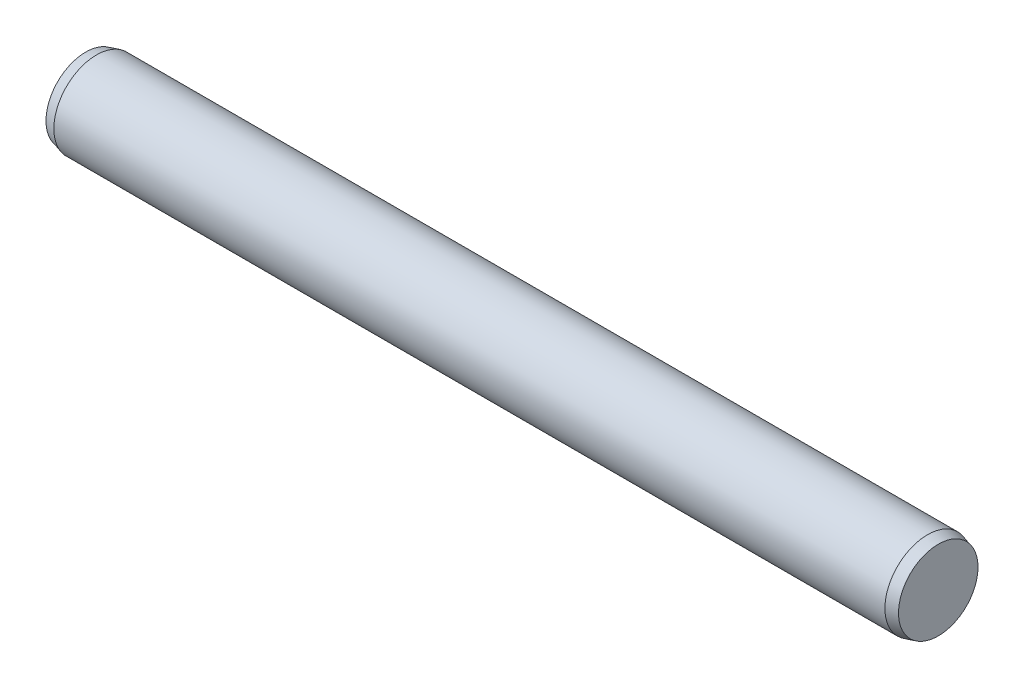
ISO-10303-21;
HEADER;
FILE_DESCRIPTION(('STEP AP214'),'2;1');
FILE_NAME('part.step','',(''),(''),'','','');
FILE_SCHEMA(('AUTOMOTIVE_DESIGN { 1 0 10303 214 1 1 1 1 }'));
ENDSEC;
DATA;
#1=APPLICATION_CONTEXT('core data for automotive mechanical design processes');
#2=APPLICATION_PROTOCOL_DEFINITION('international standard','automotive_design',2000,#1);
#3=PRODUCT_CONTEXT('',#1,'mechanical');
#4=PRODUCT('Part','Part','',(#3));
#5=PRODUCT_RELATED_PRODUCT_CATEGORY('part','',(#4));
#6=PRODUCT_DEFINITION_FORMATION('','',#4);
#7=PRODUCT_DEFINITION_CONTEXT('part definition',#1,'design');
#8=PRODUCT_DEFINITION('design','',#6,#7);
#9=PRODUCT_DEFINITION_SHAPE('','',#8);
#10=(LENGTH_UNIT() NAMED_UNIT(*) SI_UNIT(.MILLI.,.METRE.));
#11=(NAMED_UNIT(*) PLANE_ANGLE_UNIT() SI_UNIT($,.RADIAN.));
#12=(NAMED_UNIT(*) SI_UNIT($,.STERADIAN.) SOLID_ANGLE_UNIT());
#13=UNCERTAINTY_MEASURE_WITH_UNIT(LENGTH_MEASURE(1.E-05),#10,'distance_accuracy_value','');
#14=(GEOMETRIC_REPRESENTATION_CONTEXT(3) GLOBAL_UNCERTAINTY_ASSIGNED_CONTEXT((#13)) GLOBAL_UNIT_ASSIGNED_CONTEXT((#10,
#11,#12)) REPRESENTATION_CONTEXT('',''));
#15=CARTESIAN_POINT('',(0.,0.,0.));
#16=DIRECTION('',(0.,0.,1.));
#17=DIRECTION('',(1.,0.,0.));
#18=AXIS2_PLACEMENT_3D('',#15,#16,#17);
#19=CARTESIAN_POINT('',(-24.37,0.,0.));
#20=DIRECTION('',(1.,0.,0.));
#21=DIRECTION('',(0.,0.,-1.));
#22=AXIS2_PLACEMENT_3D('',#19,#20,#21);
#23=CYLINDRICAL_SURFACE('',#22,2.5);
#24=CARTESIAN_POINT('',(-24.37,0.,0.));
#25=DIRECTION('',(-1.,0.,0.));
#26=DIRECTION('',(0.,0.,1.));
#27=AXIS2_PLACEMENT_3D('',#24,#25,#26);
#28=CIRCLE('',#27,2.5);
#29=CARTESIAN_POINT('',(-24.37,0.,2.5));
#30=VERTEX_POINT('',#29);
#31=EDGE_CURVE('E54',#30,#30,#28,.T.);
#32=ORIENTED_EDGE('',*,*,#31,.F.);
#33=EDGE_LOOP('',(#32));
#34=FACE_BOUND('',#33,.T.);
#35=CARTESIAN_POINT('',(24.37,0.,0.));
#36=DIRECTION('',(1.,0.,0.));
#37=DIRECTION('',(0.,0.,-1.));
#38=AXIS2_PLACEMENT_3D('',#35,#36,#37);
#39=CIRCLE('',#38,2.5);
#40=CARTESIAN_POINT('',(24.37,0.,-2.5));
#41=VERTEX_POINT('',#40);
#42=EDGE_CURVE('E10',#41,#41,#39,.T.);
#43=ORIENTED_EDGE('',*,*,#42,.F.);
#44=EDGE_LOOP('',(#43));
#45=FACE_BOUND('',#44,.T.);
#46=ADVANCED_FACE('F37',(#34,#45),#23,.T.);
#47=CARTESIAN_POINT('',(24.37,0.,0.));
#48=DIRECTION('',(-1.,0.,0.));
#49=DIRECTION('',(0.,0.,-1.));
#50=AXIS2_PLACEMENT_3D('',#47,#48,#49);
#51=CONICAL_SURFACE('',#50,2.5,0.26179938779915);
#52=CARTESIAN_POINT('',(25.,0.,0.));
#53=DIRECTION('',(1.,0.,0.));
#54=DIRECTION('',(0.,0.,-1.));
#55=AXIS2_PLACEMENT_3D('',#52,#53,#54);
#56=CIRCLE('',#55,2.33119200876839);
#57=CARTESIAN_POINT('',(25.,0.,-2.33119200876839));
#58=VERTEX_POINT('',#57);
#59=EDGE_CURVE('E44',#58,#58,#56,.T.);
#60=ORIENTED_EDGE('',*,*,#59,.F.);
#61=EDGE_LOOP('',(#60));
#62=FACE_BOUND('',#61,.T.);
#63=ORIENTED_EDGE('',*,*,#42,.T.);
#64=EDGE_LOOP('',(#63));
#65=FACE_BOUND('',#64,.T.);
#66=ADVANCED_FACE('F65',(#62,#65),#51,.T.);
#67=CARTESIAN_POINT('',(25.,0.,0.));
#68=DIRECTION('',(1.,0.,0.));
#69=DIRECTION('',(0.,0.,-1.));
#70=AXIS2_PLACEMENT_3D('',#67,#68,#69);
#71=PLANE('',#70);
#72=ORIENTED_EDGE('',*,*,#59,.T.);
#73=EDGE_LOOP('',(#72));
#74=FACE_BOUND('',#73,.T.);
#75=ADVANCED_FACE('F69',(#74),#71,.T.);
#76=CARTESIAN_POINT('',(-24.37,0.,0.));
#77=DIRECTION('',(1.,0.,0.));
#78=DIRECTION('',(0.,0.,1.));
#79=AXIS2_PLACEMENT_3D('',#76,#77,#78);
#80=CONICAL_SURFACE('',#79,2.5,0.26179938779915);
#81=CARTESIAN_POINT('',(-25.,0.,0.));
#82=DIRECTION('',(-1.,0.,0.));
#83=DIRECTION('',(0.,0.,1.));
#84=AXIS2_PLACEMENT_3D('',#81,#82,#83);
#85=CIRCLE('',#84,2.33119200876839);
#86=CARTESIAN_POINT('',(-25.,0.,2.33119200876839));
#87=VERTEX_POINT('',#86);
#88=EDGE_CURVE('E49',#87,#87,#85,.T.);
#89=ORIENTED_EDGE('',*,*,#88,.F.);
#90=EDGE_LOOP('',(#89));
#91=FACE_BOUND('',#90,.T.);
#92=ORIENTED_EDGE('',*,*,#31,.T.);
#93=EDGE_LOOP('',(#92));
#94=FACE_BOUND('',#93,.T.);
#95=ADVANCED_FACE('F61',(#91,#94),#80,.T.);
#96=CARTESIAN_POINT('',(-25.,0.,0.));
#97=DIRECTION('',(-1.,0.,0.));
#98=DIRECTION('',(0.,0.,1.));
#99=AXIS2_PLACEMENT_3D('',#96,#97,#98);
#100=PLANE('',#99);
#101=ORIENTED_EDGE('',*,*,#88,.T.);
#102=EDGE_LOOP('',(#101));
#103=FACE_BOUND('',#102,.T.);
#104=ADVANCED_FACE('F78',(#103),#100,.T.);
#105=CLOSED_SHELL('',(#46,#66,#75,#95,#104));
#106=MANIFOLD_SOLID_BREP('B2',#105);
#107=ADVANCED_BREP_SHAPE_REPRESENTATION('',(#18,#106),#14);
#108=SHAPE_DEFINITION_REPRESENTATION(#9,#107);
ENDSEC;
END-ISO-10303-21;
